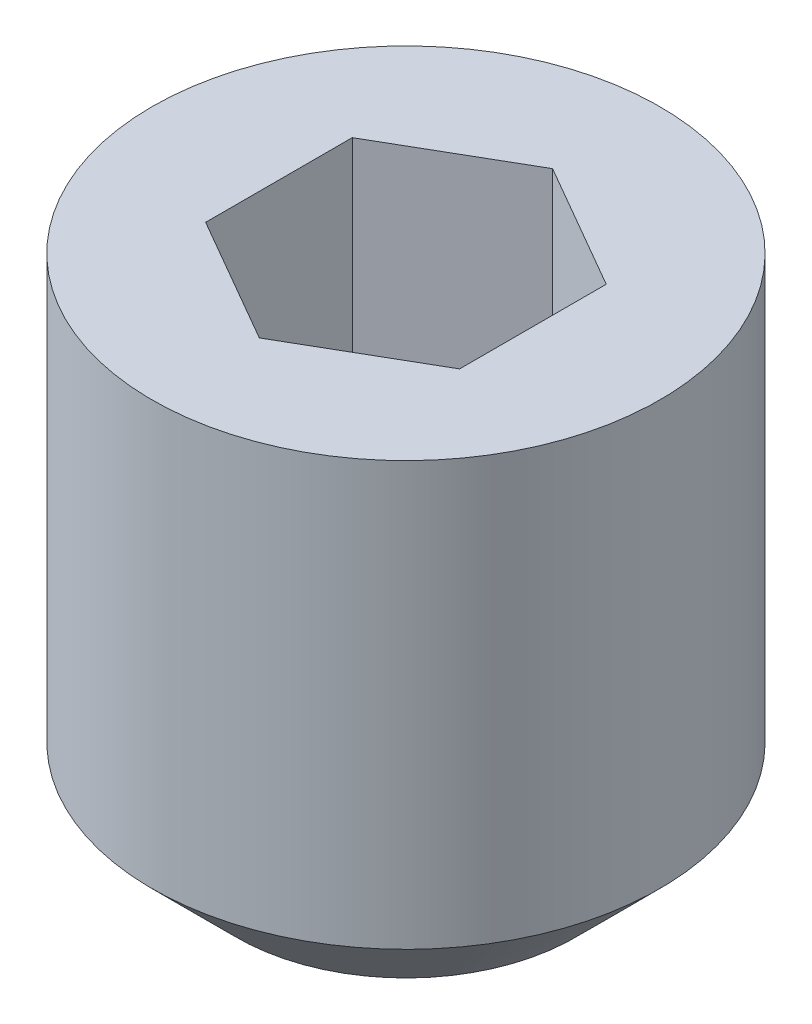
ISO-10303-21;
HEADER;
FILE_DESCRIPTION(('STEP AP214'),'2;1');
FILE_NAME('part.step','',(''),(''),'','','');
FILE_SCHEMA(('AUTOMOTIVE_DESIGN { 1 0 10303 214 1 1 1 1 }'));
ENDSEC;
DATA;
#1=APPLICATION_CONTEXT('core data for automotive mechanical design processes');
#2=APPLICATION_PROTOCOL_DEFINITION('international standard','automotive_design',2000,#1);
#3=PRODUCT_CONTEXT('',#1,'mechanical');
#4=PRODUCT('Part','Part','',(#3));
#5=PRODUCT_RELATED_PRODUCT_CATEGORY('part','',(#4));
#6=PRODUCT_DEFINITION_FORMATION('','',#4);
#7=PRODUCT_DEFINITION_CONTEXT('part definition',#1,'design');
#8=PRODUCT_DEFINITION('design','',#6,#7);
#9=PRODUCT_DEFINITION_SHAPE('','',#8);
#10=(LENGTH_UNIT() NAMED_UNIT(*) SI_UNIT(.MILLI.,.METRE.));
#11=(NAMED_UNIT(*) PLANE_ANGLE_UNIT() SI_UNIT($,.RADIAN.));
#12=(NAMED_UNIT(*) SI_UNIT($,.STERADIAN.) SOLID_ANGLE_UNIT());
#13=UNCERTAINTY_MEASURE_WITH_UNIT(LENGTH_MEASURE(1.E-05),#10,'distance_accuracy_value','');
#14=(GEOMETRIC_REPRESENTATION_CONTEXT(3) GLOBAL_UNCERTAINTY_ASSIGNED_CONTEXT((#13)) GLOBAL_UNIT_ASSIGNED_CONTEXT((#10,
#11,#12)) REPRESENTATION_CONTEXT('',''));
#15=CARTESIAN_POINT('',(0.,0.,0.));
#16=DIRECTION('',(0.,0.,1.));
#17=DIRECTION('',(1.,0.,0.));
#18=AXIS2_PLACEMENT_3D('',#15,#16,#17);
#19=CARTESIAN_POINT('',(0.,3.,0.));
#20=DIRECTION('',(0.,1.,0.));
#21=DIRECTION('',(-1.,0.,0.));
#22=AXIS2_PLACEMENT_3D('',#19,#20,#21);
#23=CYLINDRICAL_SURFACE('',#22,1.5);
#24=CARTESIAN_POINT('',(0.,3.,0.));
#25=DIRECTION('',(0.,1.,0.));
#26=DIRECTION('',(-1.,0.,0.));
#27=AXIS2_PLACEMENT_3D('',#24,#25,#26);
#28=CIRCLE('',#27,1.5);
#29=CARTESIAN_POINT('',(-1.5,3.,0.));
#30=VERTEX_POINT('',#29);
#31=EDGE_CURVE('E11',#30,#30,#28,.T.);
#32=ORIENTED_EDGE('',*,*,#31,.F.);
#33=EDGE_LOOP('',(#32));
#34=FACE_BOUND('',#33,.T.);
#35=CARTESIAN_POINT('',(0.,0.499999999999995,0.));
#36=DIRECTION('',(0.,1.,0.));
#37=DIRECTION('',(-1.,0.,0.));
#38=AXIS2_PLACEMENT_3D('',#35,#36,#37);
#39=CIRCLE('',#38,1.5);
#40=CARTESIAN_POINT('',(-1.5,0.499999999999995,0.));
#41=VERTEX_POINT('',#40);
#42=EDGE_CURVE('E152',#41,#41,#39,.T.);
#43=ORIENTED_EDGE('',*,*,#42,.T.);
#44=EDGE_LOOP('',(#43));
#45=FACE_BOUND('',#44,.T.);
#46=ADVANCED_FACE('F36',(#34,#45),#23,.T.);
#47=CARTESIAN_POINT('',(0.,3.,0.));
#48=DIRECTION('',(0.,-1.,0.));
#49=DIRECTION('',(1.,0.,0.));
#50=AXIS2_PLACEMENT_3D('',#47,#48,#49);
#51=PLANE('',#50);
#52=ORIENTED_EDGE('',*,*,#31,.T.);
#53=EDGE_LOOP('',(#52));
#54=FACE_BOUND('',#53,.T.);
#55=DIRECTION('',(-0.866025403784438,0.,0.5));
#56=VECTOR('',#55,1.);
#57=CARTESIAN_POINT('',(0.,3.,-0.866025403784438));
#58=LINE('',#57,#56);
#59=CARTESIAN_POINT('',(0.,3.,-0.866025403784439));
#60=VERTEX_POINT('',#59);
#61=CARTESIAN_POINT('',(-0.75,3.,-0.433012701892219));
#62=VERTEX_POINT('',#61);
#63=EDGE_CURVE('E151',#60,#62,#58,.T.);
#64=ORIENTED_EDGE('',*,*,#63,.F.);
#65=DIRECTION('',(-0.866025403784439,0.,-0.5));
#66=VECTOR('',#65,1.);
#67=CARTESIAN_POINT('',(0.75,3.,-0.433012701892219));
#68=LINE('',#67,#66);
#69=CARTESIAN_POINT('',(0.75,3.,-0.433012701892219));
#70=VERTEX_POINT('',#69);
#71=EDGE_CURVE('E51',#70,#60,#68,.T.);
#72=ORIENTED_EDGE('',*,*,#71,.F.);
#73=DIRECTION('',(0.,0.,-1.));
#74=VECTOR('',#73,1.);
#75=CARTESIAN_POINT('',(0.75,3.,0.433012701892219));
#76=LINE('',#75,#74);
#77=CARTESIAN_POINT('',(0.75,3.,0.433012701892219));
#78=VERTEX_POINT('',#77);
#79=EDGE_CURVE('E121',#78,#70,#76,.T.);
#80=ORIENTED_EDGE('',*,*,#79,.F.);
#81=DIRECTION('',(0.866025403784439,0.,-0.5));
#82=VECTOR('',#81,1.);
#83=CARTESIAN_POINT('',(0.,3.,0.866025403784438));
#84=LINE('',#83,#82);
#85=CARTESIAN_POINT('',(0.,3.,0.866025403784438));
#86=VERTEX_POINT('',#85);
#87=EDGE_CURVE('E159',#86,#78,#84,.T.);
#88=ORIENTED_EDGE('',*,*,#87,.F.);
#89=DIRECTION('',(0.866025403784439,0.,0.5));
#90=VECTOR('',#89,1.);
#91=CARTESIAN_POINT('',(-0.75,3.,0.433012701892219));
#92=LINE('',#91,#90);
#93=CARTESIAN_POINT('',(-0.75,3.,0.433012701892219));
#94=VERTEX_POINT('',#93);
#95=EDGE_CURVE('E156',#94,#86,#92,.T.);
#96=ORIENTED_EDGE('',*,*,#95,.F.);
#97=DIRECTION('',(0.,0.,1.));
#98=VECTOR('',#97,1.);
#99=CARTESIAN_POINT('',(-0.75,3.,-0.433012701892219));
#100=LINE('',#99,#98);
#101=EDGE_CURVE('E154',#62,#94,#100,.T.);
#102=ORIENTED_EDGE('',*,*,#101,.F.);
#103=EDGE_LOOP('',(#64,#72,#80,#88,#96,#102));
#104=FACE_BOUND('',#103,.T.);
#105=ADVANCED_FACE('F199',(#54,#104),#51,.F.);
#106=CARTESIAN_POINT('',(0.75,1.8,-0.433012701892219));
#107=DIRECTION('',(0.5,0.,-0.866025403784439));
#108=DIRECTION('',(-0.866025403784439,0.,-0.5));
#109=AXIS2_PLACEMENT_3D('',#106,#107,#108);
#110=PLANE('',#109);
#111=DIRECTION('',(-0.866025403784439,0.,-0.5));
#112=VECTOR('',#111,1.);
#113=CARTESIAN_POINT('',(0.75,1.8,-0.433012701892219));
#114=LINE('',#113,#112);
#115=CARTESIAN_POINT('',(0.75,1.8,-0.433012701892219));
#116=VERTEX_POINT('',#115);
#117=CARTESIAN_POINT('',(0.375,1.8,-0.649519052838329));
#118=VERTEX_POINT('',#117);
#119=EDGE_CURVE('E120',#116,#118,#114,.T.);
#120=ORIENTED_EDGE('',*,*,#119,.F.);
#121=DIRECTION('',(0.,1.,0.));
#122=VECTOR('',#121,1.);
#123=CARTESIAN_POINT('',(0.75,1.8,-0.433012701892219));
#124=LINE('',#123,#122);
#125=EDGE_CURVE('E162',#116,#70,#124,.T.);
#126=ORIENTED_EDGE('',*,*,#125,.T.);
#127=ORIENTED_EDGE('',*,*,#71,.T.);
#128=DIRECTION('',(0.,1.,0.));
#129=VECTOR('',#128,1.);
#130=CARTESIAN_POINT('',(0.,1.8,-0.866025403784438));
#131=LINE('',#130,#129);
#132=CARTESIAN_POINT('',(0.,1.8,-0.866025403784438));
#133=VERTEX_POINT('',#132);
#134=EDGE_CURVE('E123',#133,#60,#131,.T.);
#135=ORIENTED_EDGE('',*,*,#134,.F.);
#136=EDGE_CURVE('E112',#118,#133,#114,.T.);
#137=ORIENTED_EDGE('',*,*,#136,.F.);
#138=EDGE_LOOP('',(#120,#126,#127,#135,#137));
#139=FACE_BOUND('',#138,.T.);
#140=ADVANCED_FACE('F124',(#139),#110,.F.);
#141=CARTESIAN_POINT('',(0.75,1.8,0.433012701892219));
#142=DIRECTION('',(1.,0.,0.));
#143=DIRECTION('',(0.,1.,0.));
#144=AXIS2_PLACEMENT_3D('',#141,#142,#143);
#145=PLANE('',#144);
#146=DIRECTION('',(0.,0.,-1.));
#147=VECTOR('',#146,1.);
#148=CARTESIAN_POINT('',(0.75,1.8,0.433012701892219));
#149=LINE('',#148,#147);
#150=CARTESIAN_POINT('',(0.75,1.8,0.433012701892219));
#151=VERTEX_POINT('',#150);
#152=CARTESIAN_POINT('',(0.75,1.8,0.));
#153=VERTEX_POINT('',#152);
#154=EDGE_CURVE('E128',#151,#153,#149,.T.);
#155=ORIENTED_EDGE('',*,*,#154,.F.);
#156=DIRECTION('',(0.,1.,0.));
#157=VECTOR('',#156,1.);
#158=CARTESIAN_POINT('',(0.75,1.8,0.433012701892219));
#159=LINE('',#158,#157);
#160=EDGE_CURVE('E165',#151,#78,#159,.T.);
#161=ORIENTED_EDGE('',*,*,#160,.T.);
#162=ORIENTED_EDGE('',*,*,#79,.T.);
#163=ORIENTED_EDGE('',*,*,#125,.F.);
#164=EDGE_CURVE('E147',#153,#116,#149,.T.);
#165=ORIENTED_EDGE('',*,*,#164,.F.);
#166=EDGE_LOOP('',(#155,#161,#162,#163,#165));
#167=FACE_BOUND('',#166,.T.);
#168=ADVANCED_FACE('F193',(#167),#145,.F.);
#169=CARTESIAN_POINT('',(0.,1.8,0.866025403784438));
#170=DIRECTION('',(0.5,0.,0.866025403784439));
#171=DIRECTION('',(0.866025403784439,0.,-0.5));
#172=AXIS2_PLACEMENT_3D('',#169,#170,#171);
#173=PLANE('',#172);
#174=DIRECTION('',(0.866025403784439,0.,-0.5));
#175=VECTOR('',#174,1.);
#176=CARTESIAN_POINT('',(0.,1.8,0.866025403784438));
#177=LINE('',#176,#175);
#178=CARTESIAN_POINT('',(0.,1.8,0.866025403784438));
#179=VERTEX_POINT('',#178);
#180=CARTESIAN_POINT('',(0.375,1.8,0.649519052838329));
#181=VERTEX_POINT('',#180);
#182=EDGE_CURVE('E59',#179,#181,#177,.T.);
#183=ORIENTED_EDGE('',*,*,#182,.F.);
#184=DIRECTION('',(0.,1.,0.));
#185=VECTOR('',#184,1.);
#186=CARTESIAN_POINT('',(0.,1.8,0.866025403784438));
#187=LINE('',#186,#185);
#188=EDGE_CURVE('E168',#179,#86,#187,.T.);
#189=ORIENTED_EDGE('',*,*,#188,.T.);
#190=ORIENTED_EDGE('',*,*,#87,.T.);
#191=ORIENTED_EDGE('',*,*,#160,.F.);
#192=EDGE_CURVE('E145',#181,#151,#177,.T.);
#193=ORIENTED_EDGE('',*,*,#192,.F.);
#194=EDGE_LOOP('',(#183,#189,#190,#191,#193));
#195=FACE_BOUND('',#194,.T.);
#196=ADVANCED_FACE('F242',(#195),#173,.F.);
#197=CARTESIAN_POINT('',(-0.749999999999999,1.8,0.433012701892219));
#198=DIRECTION('',(-0.5,0.,0.866025403784439));
#199=DIRECTION('',(0.866025403784439,0.,0.5));
#200=AXIS2_PLACEMENT_3D('',#197,#198,#199);
#201=PLANE('',#200);
#202=DIRECTION('',(0.866025403784439,0.,0.5));
#203=VECTOR('',#202,1.);
#204=CARTESIAN_POINT('',(-0.749999999999999,1.8,0.433012701892219));
#205=LINE('',#204,#203);
#206=CARTESIAN_POINT('',(-0.749999999999999,1.8,0.433012701892219));
#207=VERTEX_POINT('',#206);
#208=CARTESIAN_POINT('',(-0.374999999999999,1.8,0.649519052838329));
#209=VERTEX_POINT('',#208);
#210=EDGE_CURVE('E142',#207,#209,#205,.T.);
#211=ORIENTED_EDGE('',*,*,#210,.F.);
#212=DIRECTION('',(0.,1.,0.));
#213=VECTOR('',#212,1.);
#214=CARTESIAN_POINT('',(-0.749999999999999,1.8,0.433012701892219));
#215=LINE('',#214,#213);
#216=EDGE_CURVE('E171',#207,#94,#215,.T.);
#217=ORIENTED_EDGE('',*,*,#216,.T.);
#218=ORIENTED_EDGE('',*,*,#95,.T.);
#219=ORIENTED_EDGE('',*,*,#188,.F.);
#220=EDGE_CURVE('E141',#209,#179,#205,.T.);
#221=ORIENTED_EDGE('',*,*,#220,.F.);
#222=EDGE_LOOP('',(#211,#217,#218,#219,#221));
#223=FACE_BOUND('',#222,.T.);
#224=ADVANCED_FACE('F239',(#223),#201,.F.);
#225=CARTESIAN_POINT('',(-0.75,1.8,-0.433012701892219));
#226=DIRECTION('',(-1.,0.,0.));
#227=DIRECTION('',(0.,0.,1.));
#228=AXIS2_PLACEMENT_3D('',#225,#226,#227);
#229=PLANE('',#228);
#230=DIRECTION('',(0.,0.,1.));
#231=VECTOR('',#230,1.);
#232=CARTESIAN_POINT('',(-0.75,1.8,-0.433012701892219));
#233=LINE('',#232,#231);
#234=CARTESIAN_POINT('',(-0.75,1.8,-0.433012701892219));
#235=VERTEX_POINT('',#234);
#236=CARTESIAN_POINT('',(-0.75,1.8,0.));
#237=VERTEX_POINT('',#236);
#238=EDGE_CURVE('E136',#235,#237,#233,.T.);
#239=ORIENTED_EDGE('',*,*,#238,.F.);
#240=DIRECTION('',(0.,1.,0.));
#241=VECTOR('',#240,1.);
#242=CARTESIAN_POINT('',(-0.75,1.8,-0.433012701892219));
#243=LINE('',#242,#241);
#244=EDGE_CURVE('E127',#235,#62,#243,.T.);
#245=ORIENTED_EDGE('',*,*,#244,.T.);
#246=ORIENTED_EDGE('',*,*,#101,.T.);
#247=ORIENTED_EDGE('',*,*,#216,.F.);
#248=EDGE_CURVE('E134',#237,#207,#233,.T.);
#249=ORIENTED_EDGE('',*,*,#248,.F.);
#250=EDGE_LOOP('',(#239,#245,#246,#247,#249));
#251=FACE_BOUND('',#250,.T.);
#252=ADVANCED_FACE('F204',(#251),#229,.F.);
#253=CARTESIAN_POINT('',(0.,1.8,-0.866025403784438));
#254=DIRECTION('',(-0.5,0.,-0.866025403784438));
#255=DIRECTION('',(-0.866025403784439,0.,0.5));
#256=AXIS2_PLACEMENT_3D('',#253,#254,#255);
#257=PLANE('',#256);
#258=DIRECTION('',(-0.866025403784438,0.,0.5));
#259=VECTOR('',#258,1.);
#260=CARTESIAN_POINT('',(0.,1.8,-0.866025403784438));
#261=LINE('',#260,#259);
#262=CARTESIAN_POINT('',(-0.375,1.8,-0.649519052838329));
#263=VERTEX_POINT('',#262);
#264=EDGE_CURVE('E115',#133,#263,#261,.T.);
#265=ORIENTED_EDGE('',*,*,#264,.F.);
#266=ORIENTED_EDGE('',*,*,#134,.T.);
#267=ORIENTED_EDGE('',*,*,#63,.T.);
#268=ORIENTED_EDGE('',*,*,#244,.F.);
#269=EDGE_CURVE('E133',#263,#235,#261,.T.);
#270=ORIENTED_EDGE('',*,*,#269,.F.);
#271=EDGE_LOOP('',(#265,#266,#267,#268,#270));
#272=FACE_BOUND('',#271,.T.);
#273=ADVANCED_FACE('F131',(#272),#257,.F.);
#274=CARTESIAN_POINT('',(0.,1.8,0.));
#275=DIRECTION('',(0.,1.,0.));
#276=DIRECTION('',(0.,0.,1.));
#277=AXIS2_PLACEMENT_3D('',#274,#275,#276);
#278=PLANE('',#277);
#279=ORIENTED_EDGE('',*,*,#192,.T.);
#280=ORIENTED_EDGE('',*,*,#154,.T.);
#281=CARTESIAN_POINT('',(0.,1.8,0.));
#282=DIRECTION('',(0.,1.,0.));
#283=DIRECTION('',(-1.,0.,0.));
#284=AXIS2_PLACEMENT_3D('',#281,#282,#283);
#285=CIRCLE('',#284,0.75);
#286=EDGE_CURVE('E180',#181,#153,#285,.T.);
#287=ORIENTED_EDGE('',*,*,#286,.F.);
#288=EDGE_LOOP('',(#279,#280,#287));
#289=FACE_BOUND('',#288,.T.);
#290=ADVANCED_FACE('F188',(#289),#278,.T.);
#291=ORIENTED_EDGE('',*,*,#164,.T.);
#292=ORIENTED_EDGE('',*,*,#119,.T.);
#293=EDGE_CURVE('E181',#153,#118,#285,.T.);
#294=ORIENTED_EDGE('',*,*,#293,.F.);
#295=EDGE_LOOP('',(#291,#292,#294));
#296=FACE_BOUND('',#295,.T.);
#297=ADVANCED_FACE('F197',(#296),#278,.T.);
#298=ORIENTED_EDGE('',*,*,#136,.T.);
#299=ORIENTED_EDGE('',*,*,#264,.T.);
#300=EDGE_CURVE('E117',#118,#263,#285,.T.);
#301=ORIENTED_EDGE('',*,*,#300,.F.);
#302=EDGE_LOOP('',(#298,#299,#301));
#303=FACE_BOUND('',#302,.T.);
#304=ADVANCED_FACE('F113',(#303),#278,.T.);
#305=ORIENTED_EDGE('',*,*,#269,.T.);
#306=ORIENTED_EDGE('',*,*,#238,.T.);
#307=EDGE_CURVE('E164',#263,#237,#285,.T.);
#308=ORIENTED_EDGE('',*,*,#307,.F.);
#309=EDGE_LOOP('',(#305,#306,#308));
#310=FACE_BOUND('',#309,.T.);
#311=ADVANCED_FACE('F208',(#310),#278,.T.);
#312=ORIENTED_EDGE('',*,*,#248,.T.);
#313=ORIENTED_EDGE('',*,*,#210,.T.);
#314=EDGE_CURVE('E44',#237,#209,#285,.T.);
#315=ORIENTED_EDGE('',*,*,#314,.F.);
#316=EDGE_LOOP('',(#312,#313,#315));
#317=FACE_BOUND('',#316,.T.);
#318=ADVANCED_FACE('F210',(#317),#278,.T.);
#319=ORIENTED_EDGE('',*,*,#220,.T.);
#320=ORIENTED_EDGE('',*,*,#182,.T.);
#321=EDGE_CURVE('E176',#209,#181,#285,.T.);
#322=ORIENTED_EDGE('',*,*,#321,.F.);
#323=EDGE_LOOP('',(#319,#320,#322));
#324=FACE_BOUND('',#323,.T.);
#325=ADVANCED_FACE('F216',(#324),#278,.T.);
#326=CARTESIAN_POINT('',(0.,1.36698729810778,0.));
#327=DIRECTION('',(0.,1.,0.));
#328=DIRECTION('',(-1.,0.,0.));
#329=AXIS2_PLACEMENT_3D('',#326,#327,#328);
#330=CONICAL_SURFACE('',#329,0.,1.04719755119659);
#331=ORIENTED_EDGE('',*,*,#314,.T.);
#332=ORIENTED_EDGE('',*,*,#321,.T.);
#333=ORIENTED_EDGE('',*,*,#286,.T.);
#334=ORIENTED_EDGE('',*,*,#293,.T.);
#335=ORIENTED_EDGE('',*,*,#300,.T.);
#336=ORIENTED_EDGE('',*,*,#307,.T.);
#337=EDGE_LOOP('',(#331,#332,#333,#334,#335,#336));
#338=FACE_BOUND('',#337,.T.);
#339=CARTESIAN_POINT('',(0.,1.36698729810778,0.));
#340=VERTEX_POINT('',#339);
#341=VERTEX_LOOP('',#340);
#342=FACE_BOUND('',#341,.T.);
#343=ADVANCED_FACE('F185',(#338,#342),#330,.F.);
#344=CARTESIAN_POINT('',(0.,0.499999999999995,0.));
#345=DIRECTION('',(0.,1.,0.));
#346=DIRECTION('',(-1.,0.,0.));
#347=AXIS2_PLACEMENT_3D('',#344,#345,#346);
#348=CONICAL_SURFACE('',#347,1.5,0.785398163397453);
#349=CARTESIAN_POINT('',(0.,0.,0.));
#350=DIRECTION('',(0.,1.,0.));
#351=DIRECTION('',(-1.,0.,0.));
#352=AXIS2_PLACEMENT_3D('',#349,#350,#351);
#353=CIRCLE('',#352,1.);
#354=CARTESIAN_POINT('',(-1.,0.,0.));
#355=VERTEX_POINT('',#354);
#356=EDGE_CURVE('E334',#355,#355,#353,.T.);
#357=ORIENTED_EDGE('',*,*,#356,.T.);
#358=EDGE_LOOP('',(#357));
#359=FACE_BOUND('',#358,.T.);
#360=ORIENTED_EDGE('',*,*,#42,.F.);
#361=EDGE_LOOP('',(#360));
#362=FACE_BOUND('',#361,.T.);
#363=ADVANCED_FACE('F232',(#359,#362),#348,.T.);
#364=CARTESIAN_POINT('',(0.,0.,0.));
#365=DIRECTION('',(0.,1.,0.));
#366=DIRECTION('',(-1.,0.,0.));
#367=AXIS2_PLACEMENT_3D('',#364,#365,#366);
#368=PLANE('',#367);
#369=ORIENTED_EDGE('',*,*,#356,.F.);
#370=EDGE_LOOP('',(#369));
#371=FACE_BOUND('',#370,.T.);
#372=ADVANCED_FACE('F38',(#371),#368,.F.);
#373=CLOSED_SHELL('',(#46,#105,#140,#168,#196,#224,#252,#273,#290,#297,#304,#311,#318,#325,#343,
#363,#372));
#374=MANIFOLD_SOLID_BREP('B2',#373);
#375=ADVANCED_BREP_SHAPE_REPRESENTATION('',(#18,#374),#14);
#376=SHAPE_DEFINITION_REPRESENTATION(#9,#375);
ENDSEC;
END-ISO-10303-21;
